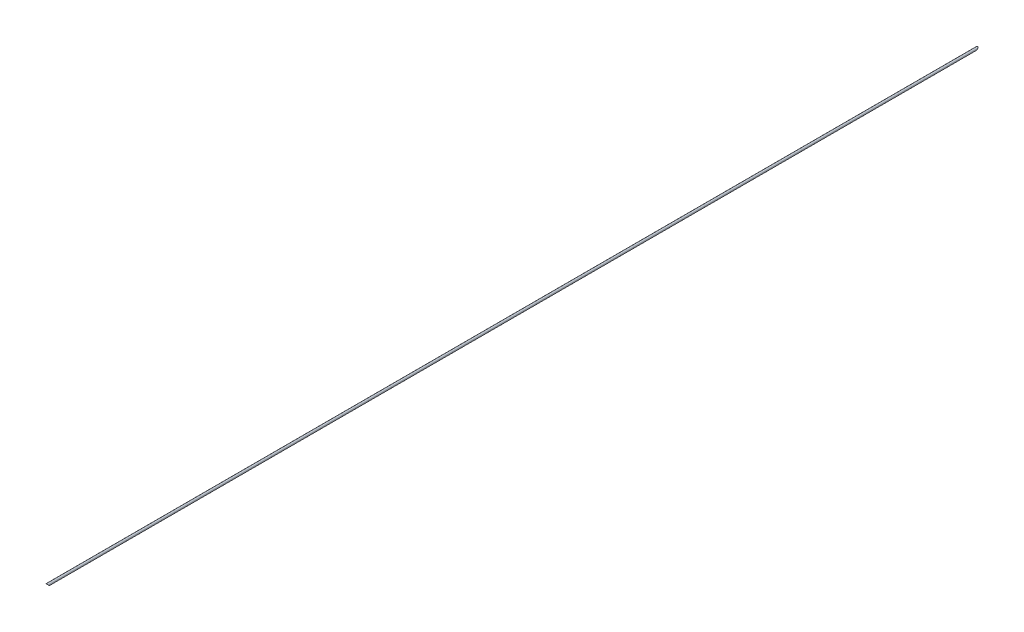
ISO-10303-21;
HEADER;
FILE_DESCRIPTION(('STEP AP214'),'2;1');
FILE_NAME('part.step','',(''),(''),'','','');
FILE_SCHEMA(('AUTOMOTIVE_DESIGN { 1 0 10303 214 1 1 1 1 }'));
ENDSEC;
DATA;
#1=APPLICATION_CONTEXT('core data for automotive mechanical design processes');
#2=APPLICATION_PROTOCOL_DEFINITION('international standard','automotive_design',2000,#1);
#3=PRODUCT_CONTEXT('',#1,'mechanical');
#4=PRODUCT('Part','Part','',(#3));
#5=PRODUCT_RELATED_PRODUCT_CATEGORY('part','',(#4));
#6=PRODUCT_DEFINITION_FORMATION('','',#4);
#7=PRODUCT_DEFINITION_CONTEXT('part definition',#1,'design');
#8=PRODUCT_DEFINITION('design','',#6,#7);
#9=PRODUCT_DEFINITION_SHAPE('','',#8);
#10=(LENGTH_UNIT() NAMED_UNIT(*) SI_UNIT(.MILLI.,.METRE.));
#11=(NAMED_UNIT(*) PLANE_ANGLE_UNIT() SI_UNIT($,.RADIAN.));
#12=(NAMED_UNIT(*) SI_UNIT($,.STERADIAN.) SOLID_ANGLE_UNIT());
#13=UNCERTAINTY_MEASURE_WITH_UNIT(LENGTH_MEASURE(1.E-05),#10,'distance_accuracy_value','');
#14=(GEOMETRIC_REPRESENTATION_CONTEXT(3) GLOBAL_UNCERTAINTY_ASSIGNED_CONTEXT((#13)) GLOBAL_UNIT_ASSIGNED_CONTEXT((#10,
#11,#12)) REPRESENTATION_CONTEXT('',''));
#15=CARTESIAN_POINT('',(0.,0.,0.));
#16=DIRECTION('',(0.,0.,1.));
#17=DIRECTION('',(1.,0.,0.));
#18=AXIS2_PLACEMENT_3D('',#15,#16,#17);
#19=CARTESIAN_POINT('',(0.,8.35025005000023,8.35025005000051));
#20=DIRECTION('',(0.,0.707106781186536,0.707106781186559));
#21=DIRECTION('',(0.,-0.707106781186559,0.707106781186536));
#22=AXIS2_PLACEMENT_3D('',#19,#20,#21);
#23=PLANE('',#22);
#24=CARTESIAN_POINT('',(0.,0.,16.7005001000004));
#25=DIRECTION('',(0.,0.707106781186536,0.707106781186559));
#26=DIRECTION('',(0.,-0.707106781186559,0.707106781186536));
#27=AXIS2_PLACEMENT_3D('',#24,#25,#26);
#28=ELLIPSE('',#27,23.6180735984115,16.7005);
#29=CARTESIAN_POINT('',(0.,-16.7005,33.4010000999999));
#30=VERTEX_POINT('',#29);
#31=EDGE_CURVE('E26',#30,#30,#28,.T.);
#32=ORIENTED_EDGE('',*,*,#31,.F.);
#33=EDGE_LOOP('',(#32));
#34=FACE_BOUND('',#33,.T.);
#35=CARTESIAN_POINT('',(0.,0.,16.7005001000004));
#36=DIRECTION('',(0.,-0.707106781186536,-0.707106781186559));
#37=DIRECTION('',(0.,-0.707106781186559,0.707106781186536));
#38=AXIS2_PLACEMENT_3D('',#35,#36,#37);
#39=ELLIPSE('',#38,18.8405773420028,13.3223);
#40=CARTESIAN_POINT('',(0.,-13.3223,30.0228001));
#41=VERTEX_POINT('',#40);
#42=EDGE_CURVE('E9',#41,#41,#39,.T.);
#43=ORIENTED_EDGE('',*,*,#42,.F.);
#44=EDGE_LOOP('',(#43));
#45=FACE_BOUND('',#44,.T.);
#46=ADVANCED_FACE('F14',(#34,#45),#23,.F.);
#47=CARTESIAN_POINT('',(0.,-6516.65575005,6516.65575005002));
#48=DIRECTION('',(0.,0.707106781186547,-0.707106781186548));
#49=DIRECTION('',(0.,0.707106781186548,0.707106781186547));
#50=AXIS2_PLACEMENT_3D('',#47,#48,#49);
#51=PLANE('',#50);
#52=CARTESIAN_POINT('',(0.,0.,13033.3115001));
#53=DIRECTION('',(0.,0.707106781186547,-0.707106781186548));
#54=DIRECTION('',(0.,-0.707106781186548,-0.707106781186547));
#55=AXIS2_PLACEMENT_3D('',#52,#53,#54);
#56=ELLIPSE('',#55,23.6180735984119,16.7005);
#57=CARTESIAN_POINT('',(0.,-16.7005,13016.6110001));
#58=VERTEX_POINT('',#57);
#59=EDGE_CURVE('E28',#58,#58,#56,.T.);
#60=ORIENTED_EDGE('',*,*,#59,.F.);
#61=EDGE_LOOP('',(#60));
#62=FACE_BOUND('',#61,.T.);
#63=CARTESIAN_POINT('',(0.,0.,13033.3115001));
#64=DIRECTION('',(0.,-0.707106781186547,0.707106781186548));
#65=DIRECTION('',(0.,-0.707106781186548,-0.707106781186547));
#66=AXIS2_PLACEMENT_3D('',#63,#64,#65);
#67=ELLIPSE('',#66,18.8405773420031,13.3223);
#68=CARTESIAN_POINT('',(0.,-13.3223,13019.9892001));
#69=VERTEX_POINT('',#68);
#70=EDGE_CURVE('E18',#69,#69,#67,.T.);
#71=ORIENTED_EDGE('',*,*,#70,.F.);
#72=EDGE_LOOP('',(#71));
#73=FACE_BOUND('',#72,.T.);
#74=ADVANCED_FACE('F38',(#62,#73),#51,.F.);
#75=CARTESIAN_POINT('',(0.,0.,0.));
#76=DIRECTION('',(0.,0.,1.));
#77=DIRECTION('',(1.,0.,0.));
#78=AXIS2_PLACEMENT_3D('',#75,#76,#77);
#79=CYLINDRICAL_SURFACE('',#78,13.3223);
#80=ORIENTED_EDGE('',*,*,#42,.T.);
#81=EDGE_LOOP('',(#80));
#82=FACE_BOUND('',#81,.T.);
#83=ORIENTED_EDGE('',*,*,#70,.T.);
#84=EDGE_LOOP('',(#83));
#85=FACE_BOUND('',#84,.T.);
#86=ADVANCED_FACE('F44',(#82,#85),#79,.F.);
#87=CARTESIAN_POINT('',(0.,0.,0.));
#88=DIRECTION('',(0.,0.,1.));
#89=DIRECTION('',(1.,0.,0.));
#90=AXIS2_PLACEMENT_3D('',#87,#88,#89);
#91=CYLINDRICAL_SURFACE('',#90,16.7005);
#92=ORIENTED_EDGE('',*,*,#31,.T.);
#93=EDGE_LOOP('',(#92));
#94=FACE_BOUND('',#93,.T.);
#95=ORIENTED_EDGE('',*,*,#59,.T.);
#96=EDGE_LOOP('',(#95));
#97=FACE_BOUND('',#96,.T.);
#98=ADVANCED_FACE('F16',(#94,#97),#91,.T.);
#99=CLOSED_SHELL('',(#46,#74,#86,#98));
#100=MANIFOLD_SOLID_BREP('B1',#99);
#101=ADVANCED_BREP_SHAPE_REPRESENTATION('',(#18,#100),#14);
#102=SHAPE_DEFINITION_REPRESENTATION(#9,#101);
ENDSEC;
END-ISO-10303-21;
